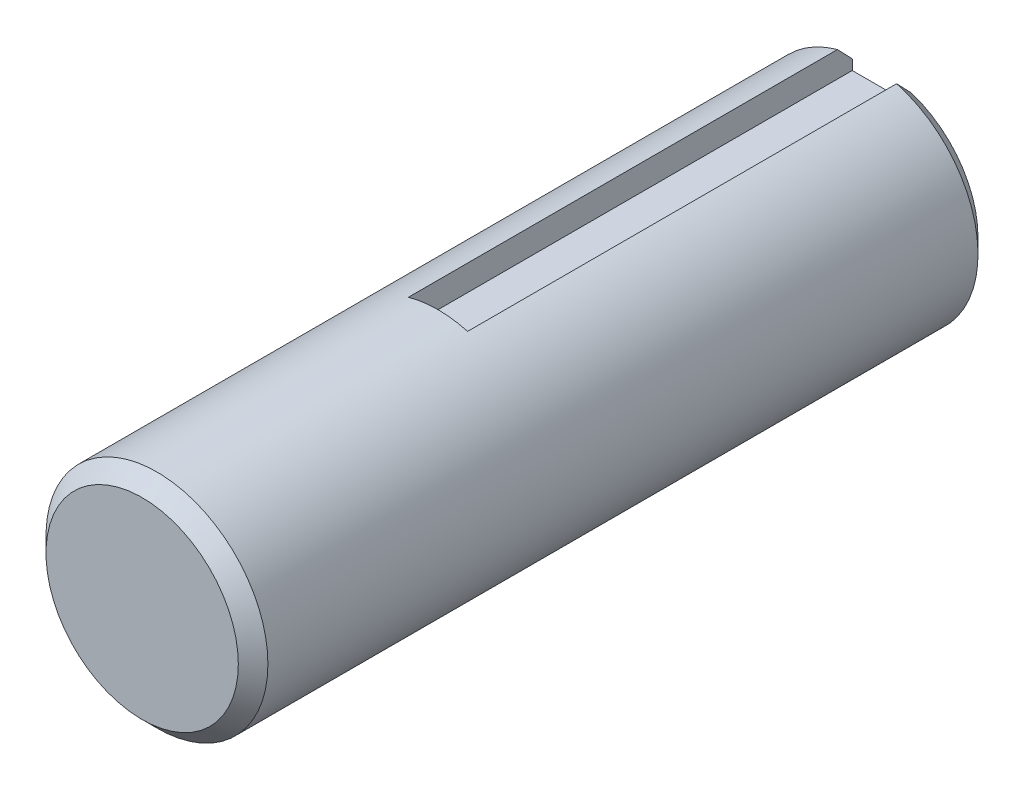
ISO-10303-21;
HEADER;
FILE_DESCRIPTION(('STEP AP214'),'2;1');
FILE_NAME('part.step','',(''),(''),'','','');
FILE_SCHEMA(('AUTOMOTIVE_DESIGN { 1 0 10303 214 1 1 1 1 }'));
ENDSEC;
DATA;
#1=APPLICATION_CONTEXT('core data for automotive mechanical design processes');
#2=APPLICATION_PROTOCOL_DEFINITION('international standard','automotive_design',2000,#1);
#3=PRODUCT_CONTEXT('',#1,'mechanical');
#4=PRODUCT('Part','Part','',(#3));
#5=PRODUCT_RELATED_PRODUCT_CATEGORY('part','',(#4));
#6=PRODUCT_DEFINITION_FORMATION('','',#4);
#7=PRODUCT_DEFINITION_CONTEXT('part definition',#1,'design');
#8=PRODUCT_DEFINITION('design','',#6,#7);
#9=PRODUCT_DEFINITION_SHAPE('','',#8);
#10=(LENGTH_UNIT() NAMED_UNIT(*) SI_UNIT(.MILLI.,.METRE.));
#11=(NAMED_UNIT(*) PLANE_ANGLE_UNIT() SI_UNIT($,.RADIAN.));
#12=(NAMED_UNIT(*) SI_UNIT($,.STERADIAN.) SOLID_ANGLE_UNIT());
#13=UNCERTAINTY_MEASURE_WITH_UNIT(LENGTH_MEASURE(1.E-05),#10,'distance_accuracy_value','');
#14=(GEOMETRIC_REPRESENTATION_CONTEXT(3) GLOBAL_UNCERTAINTY_ASSIGNED_CONTEXT((#13)) GLOBAL_UNIT_ASSIGNED_CONTEXT((#10,
#11,#12)) REPRESENTATION_CONTEXT('',''));
#15=CARTESIAN_POINT('',(0.,0.,0.));
#16=DIRECTION('',(0.,0.,1.));
#17=DIRECTION('',(1.,0.,0.));
#18=AXIS2_PLACEMENT_3D('',#15,#16,#17);
#19=CARTESIAN_POINT('',(0.,0.,100.));
#20=DIRECTION('',(0.,0.,-1.));
#21=DIRECTION('',(-1.,0.,0.));
#22=AXIS2_PLACEMENT_3D('',#19,#20,#21);
#23=CYLINDRICAL_SURFACE('',#22,15.);
#24=CARTESIAN_POINT('',(0.,0.,98.));
#25=DIRECTION('',(0.,0.,1.));
#26=DIRECTION('',(1.,0.,0.));
#27=AXIS2_PLACEMENT_3D('',#24,#25,#26);
#28=CIRCLE('',#27,15.);
#29=CARTESIAN_POINT('',(15.,0.,98.));
#30=VERTEX_POINT('',#29);
#31=EDGE_CURVE('E144',#30,#30,#28,.F.);
#32=ORIENTED_EDGE('',*,*,#31,.T.);
#33=EDGE_LOOP('',(#32));
#34=FACE_BOUND('',#33,.T.);
#35=DIRECTION('',(0.,0.,-1.));
#36=VECTOR('',#35,1.);
#37=CARTESIAN_POINT('',(-4.,14.456832294801,100.));
#38=LINE('',#37,#36);
#39=CARTESIAN_POINT('',(-4.,14.456832294801,2.00000000000002));
#40=VERTEX_POINT('',#39);
#41=CARTESIAN_POINT('',(-4.,14.456832294801,60.));
#42=VERTEX_POINT('',#41);
#43=EDGE_CURVE('E113',#40,#42,#38,.F.);
#44=ORIENTED_EDGE('',*,*,#43,.F.);
#45=CARTESIAN_POINT('',(0.,0.,2.00000000000002));
#46=DIRECTION('',(0.,0.,1.));
#47=DIRECTION('',(1.,0.,0.));
#48=AXIS2_PLACEMENT_3D('',#45,#46,#47);
#49=CIRCLE('',#48,15.);
#50=CARTESIAN_POINT('',(4.,14.456832294801,2.00000000000002));
#51=VERTEX_POINT('',#50);
#52=EDGE_CURVE('E147',#40,#51,#49,.T.);
#53=ORIENTED_EDGE('',*,*,#52,.T.);
#54=DIRECTION('',(0.,0.,-1.));
#55=VECTOR('',#54,1.);
#56=CARTESIAN_POINT('',(4.,14.456832294801,100.));
#57=LINE('',#56,#55);
#58=CARTESIAN_POINT('',(4.,14.456832294801,60.));
#59=VERTEX_POINT('',#58);
#60=EDGE_CURVE('E79',#59,#51,#57,.T.);
#61=ORIENTED_EDGE('',*,*,#60,.F.);
#62=CARTESIAN_POINT('',(0.,0.,60.));
#63=DIRECTION('',(0.,0.,-1.));
#64=DIRECTION('',(-1.,0.,0.));
#65=AXIS2_PLACEMENT_3D('',#62,#63,#64);
#66=CIRCLE('',#65,15.);
#67=EDGE_CURVE('E12',#42,#59,#66,.T.);
#68=ORIENTED_EDGE('',*,*,#67,.F.);
#69=EDGE_LOOP('',(#44,#53,#61,#68));
#70=FACE_BOUND('',#69,.T.);
#71=ADVANCED_FACE('F63',(#34,#70),#23,.T.);
#72=CARTESIAN_POINT('',(0.,0.,0.));
#73=DIRECTION('',(0.,0.,1.));
#74=DIRECTION('',(1.,0.,0.));
#75=AXIS2_PLACEMENT_3D('',#72,#73,#74);
#76=PLANE('',#75);
#77=DIRECTION('',(0.,-1.,0.));
#78=VECTOR('',#77,1.);
#79=CARTESIAN_POINT('',(-4.,0.,0.));
#80=LINE('',#79,#78);
#81=CARTESIAN_POINT('',(-4.,12.369316876853,0.));
#82=VERTEX_POINT('',#81);
#83=CARTESIAN_POINT('',(-4.,11.,0.));
#84=VERTEX_POINT('',#83);
#85=EDGE_CURVE('E128',#82,#84,#80,.T.);
#86=ORIENTED_EDGE('',*,*,#85,.T.);
#87=DIRECTION('',(-1.,0.,0.));
#88=VECTOR('',#87,1.);
#89=CARTESIAN_POINT('',(4.,11.,0.));
#90=LINE('',#89,#88);
#91=CARTESIAN_POINT('',(4.,11.,0.));
#92=VERTEX_POINT('',#91);
#93=EDGE_CURVE('E126',#92,#84,#90,.T.);
#94=ORIENTED_EDGE('',*,*,#93,.F.);
#95=DIRECTION('',(0.,1.,0.));
#96=VECTOR('',#95,1.);
#97=CARTESIAN_POINT('',(4.,0.,0.));
#98=LINE('',#97,#96);
#99=CARTESIAN_POINT('',(4.,12.369316876853,0.));
#100=VERTEX_POINT('',#99);
#101=EDGE_CURVE('E118',#92,#100,#98,.T.);
#102=ORIENTED_EDGE('',*,*,#101,.T.);
#103=CARTESIAN_POINT('',(0.,0.,0.));
#104=DIRECTION('',(0.,0.,1.));
#105=DIRECTION('',(1.,0.,0.));
#106=AXIS2_PLACEMENT_3D('',#103,#104,#105);
#107=CIRCLE('',#106,13.);
#108=EDGE_CURVE('E150',#100,#82,#107,.F.);
#109=ORIENTED_EDGE('',*,*,#108,.T.);
#110=EDGE_LOOP('',(#86,#94,#102,#109));
#111=FACE_BOUND('',#110,.T.);
#112=ADVANCED_FACE('F178',(#111),#76,.F.);
#113=CARTESIAN_POINT('',(0.,0.,2.00000000000002));
#114=DIRECTION('',(0.,0.,1.));
#115=DIRECTION('',(1.,0.,0.));
#116=AXIS2_PLACEMENT_3D('',#113,#114,#115);
#117=CONICAL_SURFACE('',#116,15.,0.785398163397451);
#118=ORIENTED_EDGE('',*,*,#52,.F.);
#119=CARTESIAN_POINT('',(-4.,19.0570687028297,6.4723359549996));
#120=CARTESIAN_POINT('',(-4.,18.5837111304375,6.00909744012136));
#121=CARTESIAN_POINT('',(-4.,18.1100120501722,5.5462068903867));
#122=CARTESIAN_POINT('',(-4.,17.161698615312,4.6213693799691));
#123=CARTESIAN_POINT('',(-4.,16.6870842654776,4.15942241440397));
#124=CARTESIAN_POINT('',(-4.,15.7367584657123,3.23676864754652));
#125=CARTESIAN_POINT('',(-4.,15.261047149982,2.77606170809454));
#126=CARTESIAN_POINT('',(-4.,14.308117032654,1.85620021390985));
#127=CARTESIAN_POINT('',(-4.,13.8308982181022,1.39704567258763));
#128=CARTESIAN_POINT('',(-4.,12.8743920317019,0.480768576793532));
#129=CARTESIAN_POINT('',(-4.,12.3951043955425,0.023646298074671));
#130=CARTESIAN_POINT('',(-4.,11.4337886914804,-0.887693049468855));
#131=CARTESIAN_POINT('',(-4.,10.9517606827041,-1.34191018052899));
#132=CARTESIAN_POINT('',(-4.,10.2257303986737,-2.02010146149933));
#133=CARTESIAN_POINT('',(-4.,9.98320618970275,-2.24565756933491));
#134=CARTESIAN_POINT('',(-4.,9.49694982808789,-2.69546120500504));
#135=CARTESIAN_POINT('',(-4.,9.25321768412991,-2.919708742224));
#136=CARTESIAN_POINT('',(-4.,8.76425768699065,-3.36660518088619));
#137=CARTESIAN_POINT('',(-4.,8.51902972804738,-3.58925396680822));
#138=CARTESIAN_POINT('',(-4.,8.02669257837226,-4.03247281064779));
#139=CARTESIAN_POINT('',(-4.,7.77958334112479,-4.25304281686263));
#140=CARTESIAN_POINT('',(-4.,7.53133813239002,-4.47233595499958));
#141=B_SPLINE_CURVE_WITH_KNOTS('',3,(#119,#120,#121,#122,#123,#124,#125,#126,#127,#128,#129,
#130,#131,#132,#133,#134,#135,#136,#137,#138,#139,#140),.UNSPECIFIED.,.F.,.F.,(4,2,2,2,2,2,2,2,
2,2,4),(0.,1.98693717000342,3.97386403324277,5.96055950687249,7.94727209905501,9.93424650402996,
11.9211781995472,12.9147749168152,13.9083644997275,14.9020251683683,15.8957104861268),.UNSPECIFIED.);
#142=EDGE_CURVE('E72',#40,#82,#141,.T.);
#143=ORIENTED_EDGE('',*,*,#142,.T.);
#144=ORIENTED_EDGE('',*,*,#108,.F.);
#145=CARTESIAN_POINT('',(4.,7.53133813239001,-4.47233595499959));
#146=CARTESIAN_POINT('',(4.,7.68744706052891,-4.33445814109083));
#147=CARTESIAN_POINT('',(4.,7.84309514451655,-4.19606061611867));
#148=CARTESIAN_POINT('',(4.,8.15358408579865,-3.91836568892575));
#149=CARTESIAN_POINT('',(4.,8.3084249506741,-3.77906829518372));
#150=CARTESIAN_POINT('',(4.,8.77190134184342,-3.36004207281272));
#151=CARTESIAN_POINT('',(4.,9.07950222251163,-3.07916895929644));
#152=CARTESIAN_POINT('',(4.,9.69257751837535,-2.51517060559549));
#153=CARTESIAN_POINT('',(4.,9.99805212087759,-2.23204556861697));
#154=CARTESIAN_POINT('',(4.,10.6073654699151,-1.66403545560355));
#155=CARTESIAN_POINT('',(4.,10.9112041986822,-1.37915036052359));
#156=CARTESIAN_POINT('',(4.,11.8207063020682,-0.522528420667362));
#157=CARTESIAN_POINT('',(4.,12.4244415741037,0.0512546115197369));
#158=CARTESIAN_POINT('',(4.,13.6285596370608,1.20234830651462));
#159=CARTESIAN_POINT('',(4.,14.228942346519,1.77965905433404));
#160=CARTESIAN_POINT('',(4.,15.1818472397299,2.69968397271746));
#161=CARTESIAN_POINT('',(4.,15.5351367305828,3.041604036834));
#162=CARTESIAN_POINT('',(4.,16.2410342782862,3.72613991943322));
#163=CARTESIAN_POINT('',(4.,16.5936423417427,4.06875573110437));
#164=CARTESIAN_POINT('',(4.,17.298321847873,4.75458754074573));
#165=CARTESIAN_POINT('',(4.,17.6503932515504,5.09780357877209));
#166=CARTESIAN_POINT('',(4.,18.354064181947,5.7847255519823));
#167=CARTESIAN_POINT('',(4.,18.7056637042965,6.12843149164274));
#168=CARTESIAN_POINT('',(4.,19.0570687028297,6.4723359549996));
#169=B_SPLINE_CURVE_WITH_KNOTS('',3,(#145,#146,#147,#148,#149,#150,#151,#152,#153,#154,#155,
#156,#157,#158,#159,#160,#161,#162,#163,#164,#165,#166,#167,#168),.UNSPECIFIED.,.F.,.F.,(4,2,2,
2,2,2,2,2,2,2,2,4),(0.,0.624834818535046,1.24966375831912,2.4992753081979,3.74877534840273,
4.99828893284227,7.49696474444103,9.99570100900345,11.4706594032071,12.9456034261531,
14.4206499527008,15.8957100453797),.UNSPECIFIED.);
#170=EDGE_CURVE('E153',#100,#51,#169,.T.);
#171=ORIENTED_EDGE('',*,*,#170,.T.);
#172=EDGE_LOOP('',(#118,#143,#144,#171));
#173=FACE_BOUND('',#172,.T.);
#174=ADVANCED_FACE('F65',(#173),#117,.T.);
#175=CARTESIAN_POINT('',(0.,0.,100.));
#176=DIRECTION('',(0.,0.,1.));
#177=DIRECTION('',(1.,0.,0.));
#178=AXIS2_PLACEMENT_3D('',#175,#176,#177);
#179=PLANE('',#178);
#180=CARTESIAN_POINT('',(0.,0.,100.));
#181=DIRECTION('',(0.,0.,1.));
#182=DIRECTION('',(1.,0.,0.));
#183=AXIS2_PLACEMENT_3D('',#180,#181,#182);
#184=CIRCLE('',#183,13.);
#185=CARTESIAN_POINT('',(13.,0.,100.));
#186=VERTEX_POINT('',#185);
#187=EDGE_CURVE('E141',#186,#186,#184,.T.);
#188=ORIENTED_EDGE('',*,*,#187,.T.);
#189=EDGE_LOOP('',(#188));
#190=FACE_BOUND('',#189,.T.);
#191=ADVANCED_FACE('F173',(#190),#179,.T.);
#192=CARTESIAN_POINT('',(0.,0.,100.));
#193=DIRECTION('',(0.,0.,-1.));
#194=DIRECTION('',(-1.,0.,0.));
#195=AXIS2_PLACEMENT_3D('',#192,#193,#194);
#196=CONICAL_SURFACE('',#195,13.,0.785398163397445);
#197=ORIENTED_EDGE('',*,*,#31,.F.);
#198=EDGE_LOOP('',(#197));
#199=FACE_BOUND('',#198,.T.);
#200=ORIENTED_EDGE('',*,*,#187,.F.);
#201=EDGE_LOOP('',(#200));
#202=FACE_BOUND('',#201,.T.);
#203=ADVANCED_FACE('F176',(#199,#202),#196,.T.);
#204=CARTESIAN_POINT('',(0.,0.,60.));
#205=DIRECTION('',(0.,0.,-1.));
#206=DIRECTION('',(-1.,0.,0.));
#207=AXIS2_PLACEMENT_3D('',#204,#205,#206);
#208=PLANE('',#207);
#209=ORIENTED_EDGE('',*,*,#67,.T.);
#210=DIRECTION('',(0.,1.,0.));
#211=VECTOR('',#210,1.);
#212=CARTESIAN_POINT('',(4.,0.,60.));
#213=LINE('',#212,#211);
#214=CARTESIAN_POINT('',(4.,11.,60.));
#215=VERTEX_POINT('',#214);
#216=EDGE_CURVE('E117',#215,#59,#213,.T.);
#217=ORIENTED_EDGE('',*,*,#216,.F.);
#218=DIRECTION('',(-1.,0.,0.));
#219=VECTOR('',#218,1.);
#220=CARTESIAN_POINT('',(4.,11.,60.));
#221=LINE('',#220,#219);
#222=CARTESIAN_POINT('',(-4.,11.,60.));
#223=VERTEX_POINT('',#222);
#224=EDGE_CURVE('E124',#215,#223,#221,.T.);
#225=ORIENTED_EDGE('',*,*,#224,.T.);
#226=DIRECTION('',(0.,-1.,0.));
#227=VECTOR('',#226,1.);
#228=CARTESIAN_POINT('',(-4.,0.,60.));
#229=LINE('',#228,#227);
#230=EDGE_CURVE('E108',#42,#223,#229,.T.);
#231=ORIENTED_EDGE('',*,*,#230,.F.);
#232=EDGE_LOOP('',(#209,#217,#225,#231));
#233=FACE_BOUND('',#232,.T.);
#234=ADVANCED_FACE('F131',(#233),#208,.T.);
#235=CARTESIAN_POINT('',(-4.,0.,60.));
#236=DIRECTION('',(1.,0.,0.));
#237=DIRECTION('',(0.,0.,-1.));
#238=AXIS2_PLACEMENT_3D('',#235,#236,#237);
#239=PLANE('',#238);
#240=ORIENTED_EDGE('',*,*,#43,.T.);
#241=ORIENTED_EDGE('',*,*,#230,.T.);
#242=DIRECTION('',(0.,0.,-1.));
#243=VECTOR('',#242,1.);
#244=CARTESIAN_POINT('',(-4.,11.,60.));
#245=LINE('',#244,#243);
#246=EDGE_CURVE('E111',#223,#84,#245,.T.);
#247=ORIENTED_EDGE('',*,*,#246,.T.);
#248=ORIENTED_EDGE('',*,*,#85,.F.);
#249=ORIENTED_EDGE('',*,*,#142,.F.);
#250=EDGE_LOOP('',(#240,#241,#247,#248,#249));
#251=FACE_BOUND('',#250,.T.);
#252=ADVANCED_FACE('F110',(#251),#239,.T.);
#253=CARTESIAN_POINT('',(4.,0.,60.));
#254=DIRECTION('',(-1.,0.,0.));
#255=DIRECTION('',(0.,0.,1.));
#256=AXIS2_PLACEMENT_3D('',#253,#254,#255);
#257=PLANE('',#256);
#258=ORIENTED_EDGE('',*,*,#60,.T.);
#259=ORIENTED_EDGE('',*,*,#170,.F.);
#260=ORIENTED_EDGE('',*,*,#101,.F.);
#261=DIRECTION('',(0.,0.,-1.));
#262=VECTOR('',#261,1.);
#263=CARTESIAN_POINT('',(4.,11.,60.));
#264=LINE('',#263,#262);
#265=EDGE_CURVE('E129',#215,#92,#264,.T.);
#266=ORIENTED_EDGE('',*,*,#265,.F.);
#267=ORIENTED_EDGE('',*,*,#216,.T.);
#268=EDGE_LOOP('',(#258,#259,#260,#266,#267));
#269=FACE_BOUND('',#268,.T.);
#270=ADVANCED_FACE('F164',(#269),#257,.T.);
#271=CARTESIAN_POINT('',(4.,11.,60.));
#272=DIRECTION('',(0.,-1.,0.));
#273=DIRECTION('',(1.,0.,0.));
#274=AXIS2_PLACEMENT_3D('',#271,#272,#273);
#275=PLANE('',#274);
#276=ORIENTED_EDGE('',*,*,#93,.T.);
#277=ORIENTED_EDGE('',*,*,#246,.F.);
#278=ORIENTED_EDGE('',*,*,#224,.F.);
#279=ORIENTED_EDGE('',*,*,#265,.T.);
#280=EDGE_LOOP('',(#276,#277,#278,#279));
#281=FACE_BOUND('',#280,.T.);
#282=ADVANCED_FACE('F122',(#281),#275,.F.);
#283=CLOSED_SHELL('',(#71,#112,#174,#191,#203,#234,#252,#270,#282));
#284=MANIFOLD_SOLID_BREP('B2',#283);
#285=ADVANCED_BREP_SHAPE_REPRESENTATION('',(#18,#284),#14);
#286=SHAPE_DEFINITION_REPRESENTATION(#9,#285);
ENDSEC;
END-ISO-10303-21;
